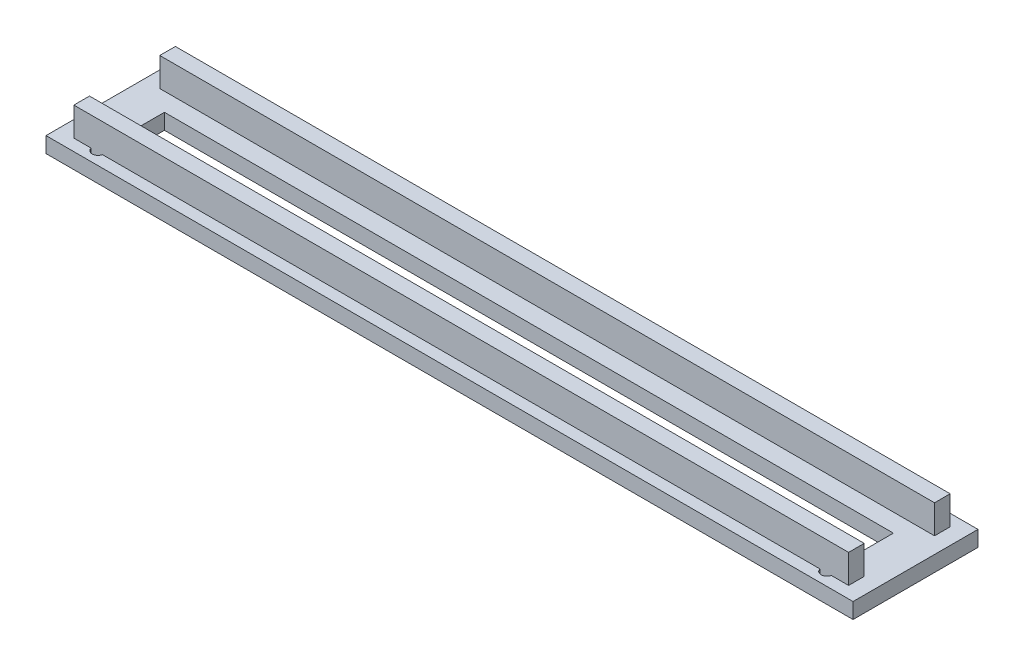
ISO-10303-21;
HEADER;
FILE_DESCRIPTION(('STEP AP214'),'2;1');
FILE_NAME('part.step','',(''),(''),'','','');
FILE_SCHEMA(('AUTOMOTIVE_DESIGN { 1 0 10303 214 1 1 1 1 }'));
ENDSEC;
DATA;
#1=APPLICATION_CONTEXT('core data for automotive mechanical design processes');
#2=APPLICATION_PROTOCOL_DEFINITION('international standard','automotive_design',2000,#1);
#3=PRODUCT_CONTEXT('',#1,'mechanical');
#4=PRODUCT('Part','Part','',(#3));
#5=PRODUCT_RELATED_PRODUCT_CATEGORY('part','',(#4));
#6=PRODUCT_DEFINITION_FORMATION('','',#4);
#7=PRODUCT_DEFINITION_CONTEXT('part definition',#1,'design');
#8=PRODUCT_DEFINITION('design','',#6,#7);
#9=PRODUCT_DEFINITION_SHAPE('','',#8);
#10=(LENGTH_UNIT() NAMED_UNIT(*) SI_UNIT(.MILLI.,.METRE.));
#11=(NAMED_UNIT(*) PLANE_ANGLE_UNIT() SI_UNIT($,.RADIAN.));
#12=(NAMED_UNIT(*) SI_UNIT($,.STERADIAN.) SOLID_ANGLE_UNIT());
#13=UNCERTAINTY_MEASURE_WITH_UNIT(LENGTH_MEASURE(1.E-05),#10,'distance_accuracy_value','');
#14=(GEOMETRIC_REPRESENTATION_CONTEXT(3) GLOBAL_UNCERTAINTY_ASSIGNED_CONTEXT((#13)) GLOBAL_UNIT_ASSIGNED_CONTEXT((#10,
#11,#12)) REPRESENTATION_CONTEXT('',''));
#15=CARTESIAN_POINT('',(0.,0.,0.));
#16=DIRECTION('',(0.,0.,1.));
#17=DIRECTION('',(1.,0.,0.));
#18=AXIS2_PLACEMENT_3D('',#15,#16,#17);
#19=CARTESIAN_POINT('',(0.,12.,0.));
#20=DIRECTION('',(0.,-1.,0.));
#21=DIRECTION('',(0.,0.,-1.));
#22=AXIS2_PLACEMENT_3D('',#19,#20,#21);
#23=PLANE('',#22);
#24=DIRECTION('',(-1.,0.,0.));
#25=VECTOR('',#24,1.);
#26=CARTESIAN_POINT('',(0.,12.,-39.));
#27=LINE('',#26,#25);
#28=CARTESIAN_POINT('',(275.612517806304,12.,-39.));
#29=VERTEX_POINT('',#28);
#30=CARTESIAN_POINT('',(-275.612517806304,12.,-39.));
#31=VERTEX_POINT('',#30);
#32=EDGE_CURVE('E271',#29,#31,#27,.T.);
#33=ORIENTED_EDGE('',*,*,#32,.F.);
#34=CARTESIAN_POINT('',(280.,12.,-38.));
#35=DIRECTION('',(0.,1.,0.));
#36=DIRECTION('',(0.,0.,1.));
#37=AXIS2_PLACEMENT_3D('',#34,#35,#36);
#38=CIRCLE('',#37,4.50000000000002);
#39=CARTESIAN_POINT('',(284.387482193696,12.,-39.));
#40=VERTEX_POINT('',#39);
#41=EDGE_CURVE('E317',#40,#29,#38,.T.);
#42=ORIENTED_EDGE('',*,*,#41,.F.);
#43=CARTESIAN_POINT('',(297.6,12.,-39.));
#44=VERTEX_POINT('',#43);
#45=EDGE_CURVE('E269',#44,#40,#27,.T.);
#46=ORIENTED_EDGE('',*,*,#45,.F.);
#47=DIRECTION('',(0.,0.,-1.));
#48=VECTOR('',#47,1.);
#49=CARTESIAN_POINT('',(297.6,12.,0.));
#50=LINE('',#49,#48);
#51=CARTESIAN_POINT('',(297.6,12.,-27.));
#52=VERTEX_POINT('',#51);
#53=EDGE_CURVE('E283',#52,#44,#50,.T.);
#54=ORIENTED_EDGE('',*,*,#53,.F.);
#55=DIRECTION('',(1.,0.,0.));
#56=VECTOR('',#55,1.);
#57=CARTESIAN_POINT('',(0.,12.,-27.));
#58=LINE('',#57,#56);
#59=CARTESIAN_POINT('',(-297.6,12.,-27.));
#60=VERTEX_POINT('',#59);
#61=EDGE_CURVE('E279',#60,#52,#58,.T.);
#62=ORIENTED_EDGE('',*,*,#61,.F.);
#63=DIRECTION('',(0.,0.,1.));
#64=VECTOR('',#63,1.);
#65=CARTESIAN_POINT('',(-297.6,12.,0.));
#66=LINE('',#65,#64);
#67=CARTESIAN_POINT('',(-297.6,12.,-39.));
#68=VERTEX_POINT('',#67);
#69=EDGE_CURVE('E281',#68,#60,#66,.T.);
#70=ORIENTED_EDGE('',*,*,#69,.F.);
#71=CARTESIAN_POINT('',(-284.387482193696,12.,-39.));
#72=VERTEX_POINT('',#71);
#73=EDGE_CURVE('E272',#72,#68,#27,.T.);
#74=ORIENTED_EDGE('',*,*,#73,.F.);
#75=CARTESIAN_POINT('',(-280.,12.,-38.));
#76=DIRECTION('',(0.,1.,0.));
#77=DIRECTION('',(0.,0.,1.));
#78=AXIS2_PLACEMENT_3D('',#75,#76,#77);
#79=CIRCLE('',#78,4.50000000000002);
#80=EDGE_CURVE('E327',#31,#72,#79,.T.);
#81=ORIENTED_EDGE('',*,*,#80,.F.);
#82=EDGE_LOOP('',(#33,#42,#46,#54,#62,#70,#74,#81));
#83=FACE_BOUND('',#82,.T.);
#84=DIRECTION('',(0.,0.,-1.));
#85=VECTOR('',#84,1.);
#86=CARTESIAN_POINT('',(310.,12.,48.));
#87=LINE('',#86,#85);
#88=CARTESIAN_POINT('',(310.,12.,48.));
#89=VERTEX_POINT('',#88);
#90=CARTESIAN_POINT('',(310.,12.,-48.));
#91=VERTEX_POINT('',#90);
#92=EDGE_CURVE('E339',#89,#91,#87,.T.);
#93=ORIENTED_EDGE('',*,*,#92,.T.);
#94=DIRECTION('',(-1.,0.,0.));
#95=VECTOR('',#94,1.);
#96=CARTESIAN_POINT('',(-310.,12.,-48.));
#97=LINE('',#96,#95);
#98=CARTESIAN_POINT('',(-310.,12.,-48.));
#99=VERTEX_POINT('',#98);
#100=EDGE_CURVE('E342',#91,#99,#97,.T.);
#101=ORIENTED_EDGE('',*,*,#100,.T.);
#102=DIRECTION('',(0.,0.,1.));
#103=VECTOR('',#102,1.);
#104=CARTESIAN_POINT('',(-310.,12.,48.));
#105=LINE('',#104,#103);
#106=CARTESIAN_POINT('',(-310.,12.,48.));
#107=VERTEX_POINT('',#106);
#108=EDGE_CURVE('E345',#99,#107,#105,.T.);
#109=ORIENTED_EDGE('',*,*,#108,.T.);
#110=DIRECTION('',(1.,0.,0.));
#111=VECTOR('',#110,1.);
#112=CARTESIAN_POINT('',(-310.,12.,48.));
#113=LINE('',#112,#111);
#114=EDGE_CURVE('E347',#107,#89,#113,.T.);
#115=ORIENTED_EDGE('',*,*,#114,.T.);
#116=EDGE_LOOP('',(#93,#101,#109,#115));
#117=FACE_BOUND('',#116,.T.);
#118=DIRECTION('',(0.,0.,-1.));
#119=VECTOR('',#118,1.);
#120=CARTESIAN_POINT('',(280.,12.,13.));
#121=LINE('',#120,#119);
#122=CARTESIAN_POINT('',(280.,12.,13.));
#123=VERTEX_POINT('',#122);
#124=CARTESIAN_POINT('',(280.,12.,-13.));
#125=VERTEX_POINT('',#124);
#126=EDGE_CURVE('E286',#123,#125,#121,.T.);
#127=ORIENTED_EDGE('',*,*,#126,.F.);
#128=DIRECTION('',(1.,0.,0.));
#129=VECTOR('',#128,1.);
#130=CARTESIAN_POINT('',(-280.,12.,13.));
#131=LINE('',#130,#129);
#132=CARTESIAN_POINT('',(-280.,12.,13.));
#133=VERTEX_POINT('',#132);
#134=EDGE_CURVE('E294',#133,#123,#131,.T.);
#135=ORIENTED_EDGE('',*,*,#134,.F.);
#136=DIRECTION('',(0.,0.,1.));
#137=VECTOR('',#136,1.);
#138=CARTESIAN_POINT('',(-280.,12.,13.));
#139=LINE('',#138,#137);
#140=CARTESIAN_POINT('',(-280.,12.,-13.));
#141=VERTEX_POINT('',#140);
#142=EDGE_CURVE('E291',#141,#133,#139,.T.);
#143=ORIENTED_EDGE('',*,*,#142,.F.);
#144=DIRECTION('',(-1.,0.,0.));
#145=VECTOR('',#144,1.);
#146=CARTESIAN_POINT('',(-280.,12.,-13.));
#147=LINE('',#146,#145);
#148=EDGE_CURVE('E288',#125,#141,#147,.T.);
#149=ORIENTED_EDGE('',*,*,#148,.F.);
#150=EDGE_LOOP('',(#127,#135,#143,#149));
#151=FACE_BOUND('',#150,.T.);
#152=DIRECTION('',(1.,0.,0.));
#153=VECTOR('',#152,1.);
#154=CARTESIAN_POINT('',(0.,12.,39.));
#155=LINE('',#154,#153);
#156=CARTESIAN_POINT('',(-275.612517806304,12.,39.));
#157=VERTEX_POINT('',#156);
#158=CARTESIAN_POINT('',(275.612517806304,12.,39.));
#159=VERTEX_POINT('',#158);
#160=EDGE_CURVE('E231',#157,#159,#155,.T.);
#161=ORIENTED_EDGE('',*,*,#160,.F.);
#162=CARTESIAN_POINT('',(-280.,12.,38.));
#163=DIRECTION('',(0.,1.,0.));
#164=DIRECTION('',(0.,0.,1.));
#165=AXIS2_PLACEMENT_3D('',#162,#163,#164);
#166=CIRCLE('',#165,4.50000000000002);
#167=CARTESIAN_POINT('',(-284.387482193696,12.,39.));
#168=VERTEX_POINT('',#167);
#169=EDGE_CURVE('E333',#168,#157,#166,.T.);
#170=ORIENTED_EDGE('',*,*,#169,.F.);
#171=CARTESIAN_POINT('',(-297.6,12.,39.));
#172=VERTEX_POINT('',#171);
#173=EDGE_CURVE('E234',#172,#168,#155,.T.);
#174=ORIENTED_EDGE('',*,*,#173,.F.);
#175=DIRECTION('',(0.,0.,1.));
#176=VECTOR('',#175,1.);
#177=CARTESIAN_POINT('',(-297.6,12.,0.));
#178=LINE('',#177,#176);
#179=CARTESIAN_POINT('',(-297.6,12.,27.));
#180=VERTEX_POINT('',#179);
#181=EDGE_CURVE('E240',#180,#172,#178,.T.);
#182=ORIENTED_EDGE('',*,*,#181,.F.);
#183=DIRECTION('',(-1.,0.,0.));
#184=VECTOR('',#183,1.);
#185=CARTESIAN_POINT('',(0.,12.,27.));
#186=LINE('',#185,#184);
#187=CARTESIAN_POINT('',(297.6,12.,27.));
#188=VERTEX_POINT('',#187);
#189=EDGE_CURVE('E242',#188,#180,#186,.T.);
#190=ORIENTED_EDGE('',*,*,#189,.F.);
#191=DIRECTION('',(0.,0.,-1.));
#192=VECTOR('',#191,1.);
#193=CARTESIAN_POINT('',(297.6,12.,0.));
#194=LINE('',#193,#192);
#195=CARTESIAN_POINT('',(297.6,12.,39.));
#196=VERTEX_POINT('',#195);
#197=EDGE_CURVE('E244',#196,#188,#194,.T.);
#198=ORIENTED_EDGE('',*,*,#197,.F.);
#199=CARTESIAN_POINT('',(284.387482193696,12.,39.));
#200=VERTEX_POINT('',#199);
#201=EDGE_CURVE('E216',#200,#196,#155,.T.);
#202=ORIENTED_EDGE('',*,*,#201,.F.);
#203=CARTESIAN_POINT('',(280.,12.,38.));
#204=DIRECTION('',(0.,1.,0.));
#205=DIRECTION('',(0.,0.,1.));
#206=AXIS2_PLACEMENT_3D('',#203,#204,#205);
#207=CIRCLE('',#206,4.50000000000002);
#208=EDGE_CURVE('E322',#159,#200,#207,.T.);
#209=ORIENTED_EDGE('',*,*,#208,.F.);
#210=EDGE_LOOP('',(#161,#170,#174,#182,#190,#198,#202,#209));
#211=FACE_BOUND('',#210,.T.);
#212=ADVANCED_FACE('F39',(#83,#117,#151,#211),#23,.F.);
#213=CARTESIAN_POINT('',(-280.,12.,38.));
#214=DIRECTION('',(0.,-1.,0.));
#215=DIRECTION('',(0.,0.,-1.));
#216=AXIS2_PLACEMENT_3D('',#213,#214,#215);
#217=CYLINDRICAL_SURFACE('',#216,4.50000000000002);
#218=ORIENTED_EDGE('',*,*,#169,.T.);
#219=DIRECTION('',(0.,-1.,0.));
#220=VECTOR('',#219,1.);
#221=CARTESIAN_POINT('',(-275.612517806304,12.,39.));
#222=LINE('',#221,#220);
#223=CARTESIAN_POINT('',(-275.612517806304,0.,39.));
#224=VERTEX_POINT('',#223);
#225=EDGE_CURVE('E233',#157,#224,#222,.T.);
#226=ORIENTED_EDGE('',*,*,#225,.T.);
#227=CARTESIAN_POINT('',(-280.,0.,38.));
#228=DIRECTION('',(0.,1.,0.));
#229=DIRECTION('',(0.,0.,1.));
#230=AXIS2_PLACEMENT_3D('',#227,#228,#229);
#231=CIRCLE('',#230,4.50000000000002);
#232=CARTESIAN_POINT('',(-284.387482193696,0.,39.));
#233=VERTEX_POINT('',#232);
#234=EDGE_CURVE('E330',#233,#224,#231,.T.);
#235=ORIENTED_EDGE('',*,*,#234,.F.);
#236=DIRECTION('',(0.,-1.,0.));
#237=VECTOR('',#236,1.);
#238=CARTESIAN_POINT('',(-284.387482193696,12.,39.));
#239=LINE('',#238,#237);
#240=EDGE_CURVE('E237',#233,#168,#239,.F.);
#241=ORIENTED_EDGE('',*,*,#240,.T.);
#242=EDGE_LOOP('',(#218,#226,#235,#241));
#243=FACE_BOUND('',#242,.T.);
#244=ADVANCED_FACE('F387',(#243),#217,.F.);
#245=CARTESIAN_POINT('',(280.,12.,38.));
#246=DIRECTION('',(0.,-1.,0.));
#247=DIRECTION('',(0.,0.,-1.));
#248=AXIS2_PLACEMENT_3D('',#245,#246,#247);
#249=CYLINDRICAL_SURFACE('',#248,4.50000000000002);
#250=ORIENTED_EDGE('',*,*,#208,.T.);
#251=DIRECTION('',(0.,-1.,0.));
#252=VECTOR('',#251,1.);
#253=CARTESIAN_POINT('',(284.387482193696,12.,39.));
#254=LINE('',#253,#252);
#255=CARTESIAN_POINT('',(284.387482193696,0.,39.));
#256=VERTEX_POINT('',#255);
#257=EDGE_CURVE('E11',#200,#256,#254,.T.);
#258=ORIENTED_EDGE('',*,*,#257,.T.);
#259=CARTESIAN_POINT('',(280.,0.,38.));
#260=DIRECTION('',(0.,1.,0.));
#261=DIRECTION('',(0.,0.,1.));
#262=AXIS2_PLACEMENT_3D('',#259,#260,#261);
#263=CIRCLE('',#262,4.50000000000002);
#264=CARTESIAN_POINT('',(275.612517806304,0.,39.));
#265=VERTEX_POINT('',#264);
#266=EDGE_CURVE('E320',#265,#256,#263,.T.);
#267=ORIENTED_EDGE('',*,*,#266,.F.);
#268=DIRECTION('',(0.,-1.,0.));
#269=VECTOR('',#268,1.);
#270=CARTESIAN_POINT('',(275.612517806304,12.,39.));
#271=LINE('',#270,#269);
#272=EDGE_CURVE('E47',#265,#159,#271,.F.);
#273=ORIENTED_EDGE('',*,*,#272,.T.);
#274=EDGE_LOOP('',(#250,#258,#267,#273));
#275=FACE_BOUND('',#274,.T.);
#276=ADVANCED_FACE('F377',(#275),#249,.F.);
#277=CARTESIAN_POINT('',(-280.,12.,-38.));
#278=DIRECTION('',(0.,-1.,0.));
#279=DIRECTION('',(0.,0.,-1.));
#280=AXIS2_PLACEMENT_3D('',#277,#278,#279);
#281=CYLINDRICAL_SURFACE('',#280,4.50000000000002);
#282=ORIENTED_EDGE('',*,*,#80,.T.);
#283=DIRECTION('',(0.,-1.,0.));
#284=VECTOR('',#283,1.);
#285=CARTESIAN_POINT('',(-284.387482193696,12.,-39.));
#286=LINE('',#285,#284);
#287=CARTESIAN_POINT('',(-284.387482193696,0.,-39.));
#288=VERTEX_POINT('',#287);
#289=EDGE_CURVE('E276',#72,#288,#286,.T.);
#290=ORIENTED_EDGE('',*,*,#289,.T.);
#291=CARTESIAN_POINT('',(-280.,0.,-38.));
#292=DIRECTION('',(0.,1.,0.));
#293=DIRECTION('',(0.,0.,1.));
#294=AXIS2_PLACEMENT_3D('',#291,#292,#293);
#295=CIRCLE('',#294,4.50000000000002);
#296=CARTESIAN_POINT('',(-275.612517806304,0.,-39.));
#297=VERTEX_POINT('',#296);
#298=EDGE_CURVE('E325',#297,#288,#295,.T.);
#299=ORIENTED_EDGE('',*,*,#298,.F.);
#300=DIRECTION('',(0.,-1.,0.));
#301=VECTOR('',#300,1.);
#302=CARTESIAN_POINT('',(-275.612517806304,12.,-39.));
#303=LINE('',#302,#301);
#304=EDGE_CURVE('E273',#297,#31,#303,.F.);
#305=ORIENTED_EDGE('',*,*,#304,.T.);
#306=EDGE_LOOP('',(#282,#290,#299,#305));
#307=FACE_BOUND('',#306,.T.);
#308=ADVANCED_FACE('F481',(#307),#281,.F.);
#309=CARTESIAN_POINT('',(280.,12.,-38.));
#310=DIRECTION('',(0.,-1.,0.));
#311=DIRECTION('',(0.,0.,-1.));
#312=AXIS2_PLACEMENT_3D('',#309,#310,#311);
#313=CYLINDRICAL_SURFACE('',#312,4.50000000000002);
#314=ORIENTED_EDGE('',*,*,#41,.T.);
#315=DIRECTION('',(0.,-1.,0.));
#316=VECTOR('',#315,1.);
#317=CARTESIAN_POINT('',(275.612517806304,12.,-39.));
#318=LINE('',#317,#316);
#319=CARTESIAN_POINT('',(275.612517806304,0.,-39.));
#320=VERTEX_POINT('',#319);
#321=EDGE_CURVE('E371',#29,#320,#318,.T.);
#322=ORIENTED_EDGE('',*,*,#321,.T.);
#323=CARTESIAN_POINT('',(280.,0.,-38.));
#324=DIRECTION('',(0.,1.,0.));
#325=DIRECTION('',(0.,0.,1.));
#326=AXIS2_PLACEMENT_3D('',#323,#324,#325);
#327=CIRCLE('',#326,4.50000000000002);
#328=CARTESIAN_POINT('',(284.387482193696,0.,-39.));
#329=VERTEX_POINT('',#328);
#330=EDGE_CURVE('E316',#329,#320,#327,.T.);
#331=ORIENTED_EDGE('',*,*,#330,.F.);
#332=DIRECTION('',(0.,-1.,0.));
#333=VECTOR('',#332,1.);
#334=CARTESIAN_POINT('',(284.387482193696,12.,-39.));
#335=LINE('',#334,#333);
#336=EDGE_CURVE('E368',#329,#40,#335,.F.);
#337=ORIENTED_EDGE('',*,*,#336,.T.);
#338=EDGE_LOOP('',(#314,#322,#331,#337));
#339=FACE_BOUND('',#338,.T.);
#340=ADVANCED_FACE('F421',(#339),#313,.F.);
#341=CARTESIAN_POINT('',(0.,0.,0.));
#342=DIRECTION('',(0.,-1.,0.));
#343=DIRECTION('',(0.,0.,-1.));
#344=AXIS2_PLACEMENT_3D('',#341,#342,#343);
#345=PLANE('',#344);
#346=DIRECTION('',(1.,0.,0.));
#347=VECTOR('',#346,1.);
#348=CARTESIAN_POINT('',(-297.6,0.,39.));
#349=LINE('',#348,#347);
#350=EDGE_CURVE('E226',#233,#224,#349,.T.);
#351=ORIENTED_EDGE('',*,*,#350,.F.);
#352=ORIENTED_EDGE('',*,*,#234,.T.);
#353=EDGE_LOOP('',(#351,#352));
#354=FACE_BOUND('',#353,.T.);
#355=EDGE_CURVE('E53',#265,#256,#349,.T.);
#356=ORIENTED_EDGE('',*,*,#355,.F.);
#357=ORIENTED_EDGE('',*,*,#266,.T.);
#358=EDGE_LOOP('',(#356,#357));
#359=FACE_BOUND('',#358,.T.);
#360=DIRECTION('',(-1.,0.,0.));
#361=VECTOR('',#360,1.);
#362=CARTESIAN_POINT('',(-297.6,0.,-39.));
#363=LINE('',#362,#361);
#364=EDGE_CURVE('E60',#329,#320,#363,.T.);
#365=ORIENTED_EDGE('',*,*,#364,.F.);
#366=ORIENTED_EDGE('',*,*,#330,.T.);
#367=EDGE_LOOP('',(#365,#366));
#368=FACE_BOUND('',#367,.T.);
#369=EDGE_CURVE('E246',#297,#288,#363,.T.);
#370=ORIENTED_EDGE('',*,*,#369,.F.);
#371=ORIENTED_EDGE('',*,*,#298,.T.);
#372=EDGE_LOOP('',(#370,#371));
#373=FACE_BOUND('',#372,.T.);
#374=DIRECTION('',(0.,0.,-1.));
#375=VECTOR('',#374,1.);
#376=CARTESIAN_POINT('',(310.,0.,48.));
#377=LINE('',#376,#375);
#378=CARTESIAN_POINT('',(310.,0.,48.));
#379=VERTEX_POINT('',#378);
#380=CARTESIAN_POINT('',(310.,0.,-48.));
#381=VERTEX_POINT('',#380);
#382=EDGE_CURVE('E336',#379,#381,#377,.T.);
#383=ORIENTED_EDGE('',*,*,#382,.F.);
#384=DIRECTION('',(1.,0.,0.));
#385=VECTOR('',#384,1.);
#386=CARTESIAN_POINT('',(-310.,0.,48.));
#387=LINE('',#386,#385);
#388=CARTESIAN_POINT('',(-310.,0.,48.));
#389=VERTEX_POINT('',#388);
#390=EDGE_CURVE('E343',#389,#379,#387,.T.);
#391=ORIENTED_EDGE('',*,*,#390,.F.);
#392=DIRECTION('',(0.,0.,1.));
#393=VECTOR('',#392,1.);
#394=CARTESIAN_POINT('',(-310.,0.,48.));
#395=LINE('',#394,#393);
#396=CARTESIAN_POINT('',(-310.,0.,-48.));
#397=VERTEX_POINT('',#396);
#398=EDGE_CURVE('E354',#397,#389,#395,.T.);
#399=ORIENTED_EDGE('',*,*,#398,.F.);
#400=DIRECTION('',(-1.,0.,0.));
#401=VECTOR('',#400,1.);
#402=CARTESIAN_POINT('',(-310.,0.,-48.));
#403=LINE('',#402,#401);
#404=EDGE_CURVE('E352',#381,#397,#403,.T.);
#405=ORIENTED_EDGE('',*,*,#404,.F.);
#406=EDGE_LOOP('',(#383,#391,#399,#405));
#407=FACE_BOUND('',#406,.T.);
#408=DIRECTION('',(1.,0.,0.));
#409=VECTOR('',#408,1.);
#410=CARTESIAN_POINT('',(-280.,0.,13.));
#411=LINE('',#410,#409);
#412=CARTESIAN_POINT('',(-280.,0.,13.));
#413=VERTEX_POINT('',#412);
#414=CARTESIAN_POINT('',(280.,0.,13.));
#415=VERTEX_POINT('',#414);
#416=EDGE_CURVE('E289',#413,#415,#411,.T.);
#417=ORIENTED_EDGE('',*,*,#416,.T.);
#418=DIRECTION('',(0.,0.,-1.));
#419=VECTOR('',#418,1.);
#420=CARTESIAN_POINT('',(280.,0.,13.));
#421=LINE('',#420,#419);
#422=CARTESIAN_POINT('',(280.,0.,-13.));
#423=VERTEX_POINT('',#422);
#424=EDGE_CURVE('E285',#415,#423,#421,.T.);
#425=ORIENTED_EDGE('',*,*,#424,.T.);
#426=DIRECTION('',(-1.,0.,0.));
#427=VECTOR('',#426,1.);
#428=CARTESIAN_POINT('',(-280.,0.,-13.));
#429=LINE('',#428,#427);
#430=CARTESIAN_POINT('',(-280.,0.,-13.));
#431=VERTEX_POINT('',#430);
#432=EDGE_CURVE('E299',#423,#431,#429,.T.);
#433=ORIENTED_EDGE('',*,*,#432,.T.);
#434=DIRECTION('',(0.,0.,1.));
#435=VECTOR('',#434,1.);
#436=CARTESIAN_POINT('',(-280.,0.,13.));
#437=LINE('',#436,#435);
#438=EDGE_CURVE('E302',#431,#413,#437,.T.);
#439=ORIENTED_EDGE('',*,*,#438,.T.);
#440=EDGE_LOOP('',(#417,#425,#433,#439));
#441=FACE_BOUND('',#440,.T.);
#442=ADVANCED_FACE('F389',(#354,#359,#368,#373,#407,#441),#345,.T.);
#443=CARTESIAN_POINT('',(310.,12.,48.));
#444=DIRECTION('',(-1.,0.,0.));
#445=DIRECTION('',(0.,0.,1.));
#446=AXIS2_PLACEMENT_3D('',#443,#444,#445);
#447=PLANE('',#446);
#448=ORIENTED_EDGE('',*,*,#382,.T.);
#449=DIRECTION('',(0.,-1.,0.));
#450=VECTOR('',#449,1.);
#451=CARTESIAN_POINT('',(310.,12.,-48.));
#452=LINE('',#451,#450);
#453=EDGE_CURVE('E365',#91,#381,#452,.T.);
#454=ORIENTED_EDGE('',*,*,#453,.F.);
#455=ORIENTED_EDGE('',*,*,#92,.F.);
#456=DIRECTION('',(0.,-1.,0.));
#457=VECTOR('',#456,1.);
#458=CARTESIAN_POINT('',(310.,12.,48.));
#459=LINE('',#458,#457);
#460=EDGE_CURVE('E349',#89,#379,#459,.T.);
#461=ORIENTED_EDGE('',*,*,#460,.T.);
#462=EDGE_LOOP('',(#448,#454,#455,#461));
#463=FACE_BOUND('',#462,.T.);
#464=ADVANCED_FACE('F41',(#463),#447,.F.);
#465=CARTESIAN_POINT('',(-310.,12.,-48.));
#466=DIRECTION('',(0.,0.,1.));
#467=DIRECTION('',(1.,0.,0.));
#468=AXIS2_PLACEMENT_3D('',#465,#466,#467);
#469=PLANE('',#468);
#470=ORIENTED_EDGE('',*,*,#404,.T.);
#471=DIRECTION('',(0.,-1.,0.));
#472=VECTOR('',#471,1.);
#473=CARTESIAN_POINT('',(-310.,12.,-48.));
#474=LINE('',#473,#472);
#475=EDGE_CURVE('E362',#99,#397,#474,.T.);
#476=ORIENTED_EDGE('',*,*,#475,.F.);
#477=ORIENTED_EDGE('',*,*,#100,.F.);
#478=ORIENTED_EDGE('',*,*,#453,.T.);
#479=EDGE_LOOP('',(#470,#476,#477,#478));
#480=FACE_BOUND('',#479,.T.);
#481=ADVANCED_FACE('F429',(#480),#469,.F.);
#482=CARTESIAN_POINT('',(-310.,12.,48.));
#483=DIRECTION('',(1.,0.,0.));
#484=DIRECTION('',(0.,0.,-1.));
#485=AXIS2_PLACEMENT_3D('',#482,#483,#484);
#486=PLANE('',#485);
#487=ORIENTED_EDGE('',*,*,#398,.T.);
#488=DIRECTION('',(0.,-1.,0.));
#489=VECTOR('',#488,1.);
#490=CARTESIAN_POINT('',(-310.,12.,48.));
#491=LINE('',#490,#489);
#492=EDGE_CURVE('E359',#107,#389,#491,.T.);
#493=ORIENTED_EDGE('',*,*,#492,.F.);
#494=ORIENTED_EDGE('',*,*,#108,.F.);
#495=ORIENTED_EDGE('',*,*,#475,.T.);
#496=EDGE_LOOP('',(#487,#493,#494,#495));
#497=FACE_BOUND('',#496,.T.);
#498=ADVANCED_FACE('F426',(#497),#486,.F.);
#499=CARTESIAN_POINT('',(-310.,12.,48.));
#500=DIRECTION('',(0.,0.,-1.));
#501=DIRECTION('',(-1.,0.,0.));
#502=AXIS2_PLACEMENT_3D('',#499,#500,#501);
#503=PLANE('',#502);
#504=ORIENTED_EDGE('',*,*,#390,.T.);
#505=ORIENTED_EDGE('',*,*,#460,.F.);
#506=ORIENTED_EDGE('',*,*,#114,.F.);
#507=ORIENTED_EDGE('',*,*,#492,.T.);
#508=EDGE_LOOP('',(#504,#505,#506,#507));
#509=FACE_BOUND('',#508,.T.);
#510=ADVANCED_FACE('F422',(#509),#503,.F.);
#511=CARTESIAN_POINT('',(280.,12.,13.));
#512=DIRECTION('',(-1.,0.,0.));
#513=DIRECTION('',(0.,0.,1.));
#514=AXIS2_PLACEMENT_3D('',#511,#512,#513);
#515=PLANE('',#514);
#516=ORIENTED_EDGE('',*,*,#424,.F.);
#517=DIRECTION('',(0.,-1.,0.));
#518=VECTOR('',#517,1.);
#519=CARTESIAN_POINT('',(280.,12.,13.));
#520=LINE('',#519,#518);
#521=EDGE_CURVE('E296',#123,#415,#520,.T.);
#522=ORIENTED_EDGE('',*,*,#521,.F.);
#523=ORIENTED_EDGE('',*,*,#126,.T.);
#524=DIRECTION('',(0.,-1.,0.));
#525=VECTOR('',#524,1.);
#526=CARTESIAN_POINT('',(280.,12.,-13.));
#527=LINE('',#526,#525);
#528=EDGE_CURVE('E313',#125,#423,#527,.T.);
#529=ORIENTED_EDGE('',*,*,#528,.T.);
#530=EDGE_LOOP('',(#516,#522,#523,#529));
#531=FACE_BOUND('',#530,.T.);
#532=ADVANCED_FACE('F425',(#531),#515,.T.);
#533=CARTESIAN_POINT('',(-280.,12.,-13.));
#534=DIRECTION('',(0.,0.,1.));
#535=DIRECTION('',(1.,0.,0.));
#536=AXIS2_PLACEMENT_3D('',#533,#534,#535);
#537=PLANE('',#536);
#538=ORIENTED_EDGE('',*,*,#432,.F.);
#539=ORIENTED_EDGE('',*,*,#528,.F.);
#540=ORIENTED_EDGE('',*,*,#148,.T.);
#541=DIRECTION('',(0.,-1.,0.));
#542=VECTOR('',#541,1.);
#543=CARTESIAN_POINT('',(-280.,12.,-13.));
#544=LINE('',#543,#542);
#545=EDGE_CURVE('E311',#141,#431,#544,.T.);
#546=ORIENTED_EDGE('',*,*,#545,.T.);
#547=EDGE_LOOP('',(#538,#539,#540,#546));
#548=FACE_BOUND('',#547,.T.);
#549=ADVANCED_FACE('F458',(#548),#537,.T.);
#550=CARTESIAN_POINT('',(-280.,12.,13.));
#551=DIRECTION('',(1.,0.,0.));
#552=DIRECTION('',(0.,0.,-1.));
#553=AXIS2_PLACEMENT_3D('',#550,#551,#552);
#554=PLANE('',#553);
#555=ORIENTED_EDGE('',*,*,#438,.F.);
#556=ORIENTED_EDGE('',*,*,#545,.F.);
#557=ORIENTED_EDGE('',*,*,#142,.T.);
#558=DIRECTION('',(0.,-1.,0.));
#559=VECTOR('',#558,1.);
#560=CARTESIAN_POINT('',(-280.,12.,13.));
#561=LINE('',#560,#559);
#562=EDGE_CURVE('E309',#133,#413,#561,.T.);
#563=ORIENTED_EDGE('',*,*,#562,.T.);
#564=EDGE_LOOP('',(#555,#556,#557,#563));
#565=FACE_BOUND('',#564,.T.);
#566=ADVANCED_FACE('F465',(#565),#554,.T.);
#567=CARTESIAN_POINT('',(-280.,12.,13.));
#568=DIRECTION('',(0.,0.,-1.));
#569=DIRECTION('',(-1.,0.,0.));
#570=AXIS2_PLACEMENT_3D('',#567,#568,#569);
#571=PLANE('',#570);
#572=ORIENTED_EDGE('',*,*,#416,.F.);
#573=ORIENTED_EDGE('',*,*,#562,.F.);
#574=ORIENTED_EDGE('',*,*,#134,.T.);
#575=ORIENTED_EDGE('',*,*,#521,.T.);
#576=EDGE_LOOP('',(#572,#573,#574,#575));
#577=FACE_BOUND('',#576,.T.);
#578=ADVANCED_FACE('F463',(#577),#571,.T.);
#579=CARTESIAN_POINT('',(297.6,34.,-27.));
#580=DIRECTION('',(-1.,0.,0.));
#581=DIRECTION('',(0.,0.,1.));
#582=AXIS2_PLACEMENT_3D('',#579,#580,#581);
#583=PLANE('',#582);
#584=DIRECTION('',(0.,-1.,0.));
#585=VECTOR('',#584,1.);
#586=CARTESIAN_POINT('',(297.6,34.,-27.));
#587=LINE('',#586,#585);
#588=CARTESIAN_POINT('',(297.6,34.,-27.));
#589=VERTEX_POINT('',#588);
#590=EDGE_CURVE('E256',#589,#52,#587,.T.);
#591=ORIENTED_EDGE('',*,*,#590,.T.);
#592=ORIENTED_EDGE('',*,*,#53,.T.);
#593=DIRECTION('',(0.,-1.,0.));
#594=VECTOR('',#593,1.);
#595=CARTESIAN_POINT('',(297.6,34.,-39.));
#596=LINE('',#595,#594);
#597=CARTESIAN_POINT('',(297.6,34.,-39.));
#598=VERTEX_POINT('',#597);
#599=EDGE_CURVE('E266',#598,#44,#596,.T.);
#600=ORIENTED_EDGE('',*,*,#599,.F.);
#601=DIRECTION('',(0.,0.,-1.));
#602=VECTOR('',#601,1.);
#603=CARTESIAN_POINT('',(297.6,34.,-27.));
#604=LINE('',#603,#602);
#605=EDGE_CURVE('E247',#589,#598,#604,.T.);
#606=ORIENTED_EDGE('',*,*,#605,.F.);
#607=EDGE_LOOP('',(#591,#592,#600,#606));
#608=FACE_BOUND('',#607,.T.);
#609=ADVANCED_FACE('F472',(#608),#583,.F.);
#610=CARTESIAN_POINT('',(-297.6,34.,-27.));
#611=DIRECTION('',(1.,0.,0.));
#612=DIRECTION('',(0.,0.,-1.));
#613=AXIS2_PLACEMENT_3D('',#610,#611,#612);
#614=PLANE('',#613);
#615=DIRECTION('',(0.,-1.,0.));
#616=VECTOR('',#615,1.);
#617=CARTESIAN_POINT('',(-297.6,34.,-39.));
#618=LINE('',#617,#616);
#619=CARTESIAN_POINT('',(-297.6,34.,-39.));
#620=VERTEX_POINT('',#619);
#621=EDGE_CURVE('E263',#620,#68,#618,.T.);
#622=ORIENTED_EDGE('',*,*,#621,.T.);
#623=ORIENTED_EDGE('',*,*,#69,.T.);
#624=DIRECTION('',(0.,-1.,0.));
#625=VECTOR('',#624,1.);
#626=CARTESIAN_POINT('',(-297.6,34.,-27.));
#627=LINE('',#626,#625);
#628=CARTESIAN_POINT('',(-297.6,34.,-27.));
#629=VERTEX_POINT('',#628);
#630=EDGE_CURVE('E260',#629,#60,#627,.T.);
#631=ORIENTED_EDGE('',*,*,#630,.F.);
#632=DIRECTION('',(0.,0.,1.));
#633=VECTOR('',#632,1.);
#634=CARTESIAN_POINT('',(-297.6,34.,-27.));
#635=LINE('',#634,#633);
#636=EDGE_CURVE('E252',#620,#629,#635,.T.);
#637=ORIENTED_EDGE('',*,*,#636,.F.);
#638=EDGE_LOOP('',(#622,#623,#631,#637));
#639=FACE_BOUND('',#638,.T.);
#640=ADVANCED_FACE('F512',(#639),#614,.F.);
#641=CARTESIAN_POINT('',(-297.6,34.,-27.));
#642=DIRECTION('',(0.,0.,-1.));
#643=DIRECTION('',(-1.,0.,0.));
#644=AXIS2_PLACEMENT_3D('',#641,#642,#643);
#645=PLANE('',#644);
#646=ORIENTED_EDGE('',*,*,#630,.T.);
#647=ORIENTED_EDGE('',*,*,#61,.T.);
#648=ORIENTED_EDGE('',*,*,#590,.F.);
#649=DIRECTION('',(1.,0.,0.));
#650=VECTOR('',#649,1.);
#651=CARTESIAN_POINT('',(-297.6,34.,-27.));
#652=LINE('',#651,#650);
#653=EDGE_CURVE('E254',#629,#589,#652,.T.);
#654=ORIENTED_EDGE('',*,*,#653,.F.);
#655=EDGE_LOOP('',(#646,#647,#648,#654));
#656=FACE_BOUND('',#655,.T.);
#657=ADVANCED_FACE('F508',(#656),#645,.F.);
#658=CARTESIAN_POINT('',(-297.6,34.,-39.));
#659=DIRECTION('',(0.,0.,1.));
#660=DIRECTION('',(1.,0.,0.));
#661=AXIS2_PLACEMENT_3D('',#658,#659,#660);
#662=PLANE('',#661);
#663=ORIENTED_EDGE('',*,*,#289,.F.);
#664=ORIENTED_EDGE('',*,*,#73,.T.);
#665=ORIENTED_EDGE('',*,*,#621,.F.);
#666=DIRECTION('',(-1.,0.,0.));
#667=VECTOR('',#666,1.);
#668=CARTESIAN_POINT('',(-297.6,34.,-39.));
#669=LINE('',#668,#667);
#670=EDGE_CURVE('E250',#598,#620,#669,.T.);
#671=ORIENTED_EDGE('',*,*,#670,.F.);
#672=ORIENTED_EDGE('',*,*,#599,.T.);
#673=ORIENTED_EDGE('',*,*,#45,.T.);
#674=ORIENTED_EDGE('',*,*,#336,.F.);
#675=ORIENTED_EDGE('',*,*,#364,.T.);
#676=ORIENTED_EDGE('',*,*,#321,.F.);
#677=ORIENTED_EDGE('',*,*,#32,.T.);
#678=ORIENTED_EDGE('',*,*,#304,.F.);
#679=ORIENTED_EDGE('',*,*,#369,.T.);
#680=EDGE_LOOP('',(#663,#664,#665,#671,#672,#673,#674,#675,#676,#677,#678,#679));
#681=FACE_BOUND('',#680,.T.);
#682=ADVANCED_FACE('F496',(#681),#662,.F.);
#683=CARTESIAN_POINT('',(0.,34.,0.));
#684=DIRECTION('',(0.,-1.,0.));
#685=DIRECTION('',(0.,0.,-1.));
#686=AXIS2_PLACEMENT_3D('',#683,#684,#685);
#687=PLANE('',#686);
#688=ORIENTED_EDGE('',*,*,#605,.T.);
#689=ORIENTED_EDGE('',*,*,#670,.T.);
#690=ORIENTED_EDGE('',*,*,#636,.T.);
#691=ORIENTED_EDGE('',*,*,#653,.T.);
#692=EDGE_LOOP('',(#688,#689,#690,#691));
#693=FACE_BOUND('',#692,.T.);
#694=ADVANCED_FACE('F514',(#693),#687,.F.);
#695=CARTESIAN_POINT('',(297.6,34.,39.));
#696=DIRECTION('',(-1.,0.,0.));
#697=DIRECTION('',(0.,0.,1.));
#698=AXIS2_PLACEMENT_3D('',#695,#696,#697);
#699=PLANE('',#698);
#700=DIRECTION('',(0.,-1.,0.));
#701=VECTOR('',#700,1.);
#702=CARTESIAN_POINT('',(297.6,34.,39.));
#703=LINE('',#702,#701);
#704=CARTESIAN_POINT('',(297.6,34.,39.));
#705=VERTEX_POINT('',#704);
#706=EDGE_CURVE('E211',#705,#196,#703,.T.);
#707=ORIENTED_EDGE('',*,*,#706,.T.);
#708=ORIENTED_EDGE('',*,*,#197,.T.);
#709=DIRECTION('',(0.,-1.,0.));
#710=VECTOR('',#709,1.);
#711=CARTESIAN_POINT('',(297.6,34.,27.));
#712=LINE('',#711,#710);
#713=CARTESIAN_POINT('',(297.6,34.,27.));
#714=VERTEX_POINT('',#713);
#715=EDGE_CURVE('E223',#714,#188,#712,.T.);
#716=ORIENTED_EDGE('',*,*,#715,.F.);
#717=DIRECTION('',(0.,0.,-1.));
#718=VECTOR('',#717,1.);
#719=CARTESIAN_POINT('',(297.6,34.,39.));
#720=LINE('',#719,#718);
#721=EDGE_CURVE('E204',#705,#714,#720,.T.);
#722=ORIENTED_EDGE('',*,*,#721,.F.);
#723=EDGE_LOOP('',(#707,#708,#716,#722));
#724=FACE_BOUND('',#723,.T.);
#725=ADVANCED_FACE('F221',(#724),#699,.F.);
#726=CARTESIAN_POINT('',(-297.6,34.,27.));
#727=DIRECTION('',(0.,0.,1.));
#728=DIRECTION('',(1.,0.,0.));
#729=AXIS2_PLACEMENT_3D('',#726,#727,#728);
#730=PLANE('',#729);
#731=ORIENTED_EDGE('',*,*,#715,.T.);
#732=ORIENTED_EDGE('',*,*,#189,.T.);
#733=DIRECTION('',(0.,-1.,0.));
#734=VECTOR('',#733,1.);
#735=CARTESIAN_POINT('',(-297.6,34.,27.));
#736=LINE('',#735,#734);
#737=CARTESIAN_POINT('',(-297.6,34.,27.));
#738=VERTEX_POINT('',#737);
#739=EDGE_CURVE('E392',#738,#180,#736,.T.);
#740=ORIENTED_EDGE('',*,*,#739,.F.);
#741=DIRECTION('',(-1.,0.,0.));
#742=VECTOR('',#741,1.);
#743=CARTESIAN_POINT('',(-297.6,34.,27.));
#744=LINE('',#743,#742);
#745=EDGE_CURVE('E224',#714,#738,#744,.T.);
#746=ORIENTED_EDGE('',*,*,#745,.F.);
#747=EDGE_LOOP('',(#731,#732,#740,#746));
#748=FACE_BOUND('',#747,.T.);
#749=ADVANCED_FACE('F396',(#748),#730,.F.);
#750=CARTESIAN_POINT('',(-297.6,34.,39.));
#751=DIRECTION('',(1.,0.,0.));
#752=DIRECTION('',(0.,0.,-1.));
#753=AXIS2_PLACEMENT_3D('',#750,#751,#752);
#754=PLANE('',#753);
#755=ORIENTED_EDGE('',*,*,#739,.T.);
#756=ORIENTED_EDGE('',*,*,#181,.T.);
#757=DIRECTION('',(0.,-1.,0.));
#758=VECTOR('',#757,1.);
#759=CARTESIAN_POINT('',(-297.6,34.,39.));
#760=LINE('',#759,#758);
#761=CARTESIAN_POINT('',(-297.6,34.,39.));
#762=VERTEX_POINT('',#761);
#763=EDGE_CURVE('E219',#762,#172,#760,.T.);
#764=ORIENTED_EDGE('',*,*,#763,.F.);
#765=DIRECTION('',(0.,0.,1.));
#766=VECTOR('',#765,1.);
#767=CARTESIAN_POINT('',(-297.6,34.,39.));
#768=LINE('',#767,#766);
#769=EDGE_CURVE('E207',#738,#762,#768,.T.);
#770=ORIENTED_EDGE('',*,*,#769,.F.);
#771=EDGE_LOOP('',(#755,#756,#764,#770));
#772=FACE_BOUND('',#771,.T.);
#773=ADVANCED_FACE('F399',(#772),#754,.F.);
#774=CARTESIAN_POINT('',(-297.6,34.,39.));
#775=DIRECTION('',(0.,0.,-1.));
#776=DIRECTION('',(-1.,0.,0.));
#777=AXIS2_PLACEMENT_3D('',#774,#775,#776);
#778=PLANE('',#777);
#779=ORIENTED_EDGE('',*,*,#763,.T.);
#780=ORIENTED_EDGE('',*,*,#173,.T.);
#781=ORIENTED_EDGE('',*,*,#240,.F.);
#782=ORIENTED_EDGE('',*,*,#350,.T.);
#783=ORIENTED_EDGE('',*,*,#225,.F.);
#784=ORIENTED_EDGE('',*,*,#160,.T.);
#785=ORIENTED_EDGE('',*,*,#272,.F.);
#786=ORIENTED_EDGE('',*,*,#355,.T.);
#787=ORIENTED_EDGE('',*,*,#257,.F.);
#788=ORIENTED_EDGE('',*,*,#201,.T.);
#789=ORIENTED_EDGE('',*,*,#706,.F.);
#790=DIRECTION('',(1.,0.,0.));
#791=VECTOR('',#790,1.);
#792=CARTESIAN_POINT('',(-297.6,34.,39.));
#793=LINE('',#792,#791);
#794=EDGE_CURVE('E200',#762,#705,#793,.T.);
#795=ORIENTED_EDGE('',*,*,#794,.F.);
#796=EDGE_LOOP('',(#779,#780,#781,#782,#783,#784,#785,#786,#787,#788,#789,#795));
#797=FACE_BOUND('',#796,.T.);
#798=ADVANCED_FACE('F214',(#797),#778,.F.);
#799=CARTESIAN_POINT('',(0.,34.,0.));
#800=DIRECTION('',(0.,-1.,0.));
#801=DIRECTION('',(0.,0.,-1.));
#802=AXIS2_PLACEMENT_3D('',#799,#800,#801);
#803=PLANE('',#802);
#804=ORIENTED_EDGE('',*,*,#721,.T.);
#805=ORIENTED_EDGE('',*,*,#745,.T.);
#806=ORIENTED_EDGE('',*,*,#769,.T.);
#807=ORIENTED_EDGE('',*,*,#794,.T.);
#808=EDGE_LOOP('',(#804,#805,#806,#807));
#809=FACE_BOUND('',#808,.T.);
#810=ADVANCED_FACE('F202',(#809),#803,.F.);
#811=CLOSED_SHELL('',(#212,#244,#276,#308,#340,#442,#464,#481,#498,#510,#532,#549,#566,#578,
#609,#640,#657,#682,#694,#725,#749,#773,#798,#810));
#812=MANIFOLD_SOLID_BREP('B2',#811);
#813=ADVANCED_BREP_SHAPE_REPRESENTATION('',(#18,#812),#14);
#814=SHAPE_DEFINITION_REPRESENTATION(#9,#813);
ENDSEC;
END-ISO-10303-21;
